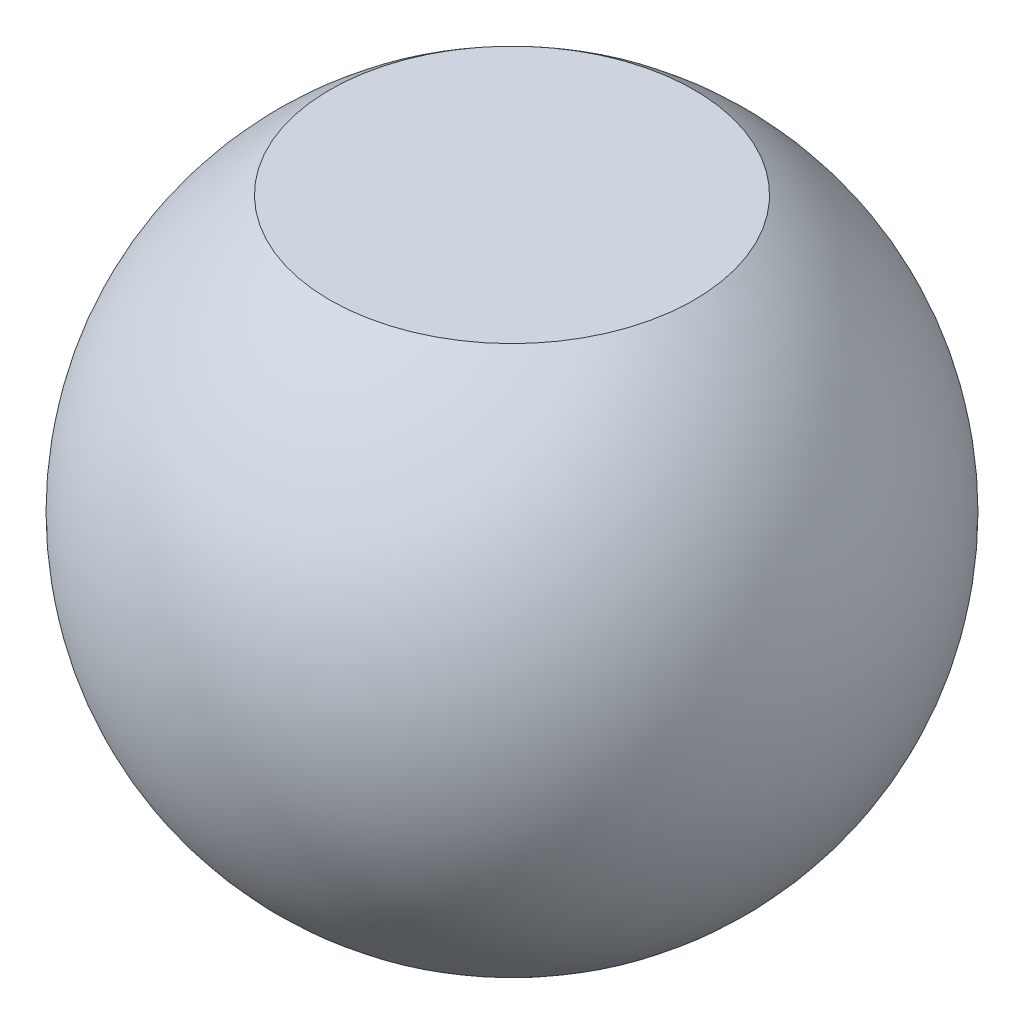
ISO-10303-21;
HEADER;
FILE_DESCRIPTION(('STEP AP214'),'2;1');
FILE_NAME('part.step','',(''),(''),'','','');
FILE_SCHEMA(('AUTOMOTIVE_DESIGN { 1 0 10303 214 1 1 1 1 }'));
ENDSEC;
DATA;
#1=APPLICATION_CONTEXT('core data for automotive mechanical design processes');
#2=APPLICATION_PROTOCOL_DEFINITION('international standard','automotive_design',2000,#1);
#3=PRODUCT_CONTEXT('',#1,'mechanical');
#4=PRODUCT('Part','Part','',(#3));
#5=PRODUCT_RELATED_PRODUCT_CATEGORY('part','',(#4));
#6=PRODUCT_DEFINITION_FORMATION('','',#4);
#7=PRODUCT_DEFINITION_CONTEXT('part definition',#1,'design');
#8=PRODUCT_DEFINITION('design','',#6,#7);
#9=PRODUCT_DEFINITION_SHAPE('','',#8);
#10=(LENGTH_UNIT() NAMED_UNIT(*) SI_UNIT(.MILLI.,.METRE.));
#11=(NAMED_UNIT(*) PLANE_ANGLE_UNIT() SI_UNIT($,.RADIAN.));
#12=(NAMED_UNIT(*) SI_UNIT($,.STERADIAN.) SOLID_ANGLE_UNIT());
#13=UNCERTAINTY_MEASURE_WITH_UNIT(LENGTH_MEASURE(1.E-05),#10,'distance_accuracy_value','');
#14=(GEOMETRIC_REPRESENTATION_CONTEXT(3) GLOBAL_UNCERTAINTY_ASSIGNED_CONTEXT((#13)) GLOBAL_UNIT_ASSIGNED_CONTEXT((#10,
#11,#12)) REPRESENTATION_CONTEXT('',''));
#15=CARTESIAN_POINT('',(0.,0.,0.));
#16=DIRECTION('',(0.,0.,1.));
#17=DIRECTION('',(1.,0.,0.));
#18=AXIS2_PLACEMENT_3D('',#15,#16,#17);
#19=CARTESIAN_POINT('',(0.,15.,0.));
#20=DIRECTION('',(0.,1.,0.));
#21=DIRECTION('',(0.,0.,1.));
#22=AXIS2_PLACEMENT_3D('',#19,#20,#21);
#23=PLANE('',#22);
#24=CARTESIAN_POINT('',(0.,15.,0.));
#25=DIRECTION('',(0.,1.,0.));
#26=DIRECTION('',(0.,0.,1.));
#27=AXIS2_PLACEMENT_3D('',#24,#25,#26);
#28=CIRCLE('',#27,9.94987437106625);
#29=CARTESIAN_POINT('',(0.,15.,9.94987437106625));
#30=VERTEX_POINT('',#29);
#31=EDGE_CURVE('E10',#30,#30,#28,.T.);
#32=ORIENTED_EDGE('',*,*,#31,.T.);
#33=EDGE_LOOP('',(#32));
#34=FACE_BOUND('',#33,.T.);
#35=ADVANCED_FACE('F34',(#34),#23,.T.);
#36=CARTESIAN_POINT('',(0.,0.,0.));
#37=DIRECTION('',(0.,1.,0.));
#38=DIRECTION('',(-1.,0.,0.));
#39=AXIS2_PLACEMENT_3D('',#36,#37,#38);
#40=SPHERICAL_SURFACE('',#39,18.);
#41=CARTESIAN_POINT('',(-15.4147778908404,-9.25640978077701,-0.838739940727965));
#42=CARTESIAN_POINT('',(-15.3804351702343,-9.30682636484546,-0.913485578954676));
#43=CARTESIAN_POINT('',(-15.3419228132776,-9.36319666589979,-0.982469287323736));
#44=CARTESIAN_POINT('',(-15.2584619752103,-9.48481406943779,-1.10773225208747));
#45=CARTESIAN_POINT('',(-15.2134920220949,-9.55009074870754,-1.16396744252283));
#46=CARTESIAN_POINT('',(-15.1191800400881,-9.68631415052398,-1.26290973639317));
#47=CARTESIAN_POINT('',(-15.069874500485,-9.75721313518111,-1.30571806685653));
#48=CARTESIAN_POINT('',(-14.9679772627336,-9.90296451952072,-1.37847195586576));
#49=CARTESIAN_POINT('',(-14.9153877573684,-9.97781427611793,-1.40842599452148));
#50=CARTESIAN_POINT('',(-14.7993386590385,-10.1420692051475,-1.459597370826));
#51=CARTESIAN_POINT('',(-14.7354906141538,-10.2318800445493,-1.478636338968));
#52=CARTESIAN_POINT('',(-14.6062571139547,-10.4124494858921,-1.5002054724113));
#53=CARTESIAN_POINT('',(-14.5408701174768,-10.5032089824929,-1.50271831461161));
#54=CARTESIAN_POINT('',(-14.4018844606048,-10.6948153189446,-1.49075980173468));
#55=CARTESIAN_POINT('',(-14.328269289792,-10.7955231446842,-1.47415183746707));
#56=CARTESIAN_POINT('',(-14.1829559958109,-10.9928109682027,-1.42041709920951));
#57=CARTESIAN_POINT('',(-14.1112574740629,-11.0893918267513,-1.3832946266982));
#58=CARTESIAN_POINT('',(-13.983541291879,-11.2601892436417,-1.29605534320235));
#59=CARTESIAN_POINT('',(-13.9268668813904,-11.3354919106266,-1.24902412042214));
#60=CARTESIAN_POINT('',(-13.8184705438116,-11.4787045466181,-1.1402626478502));
#61=CARTESIAN_POINT('',(-13.7667424938087,-11.5466236700794,-1.07855090958582));
#62=CARTESIAN_POINT('',(-13.6802632649748,-11.6596135275876,-0.954393603135493));
#63=CARTESIAN_POINT('',(-13.6441855917236,-11.7065374561735,-0.894561611860937));
#64=CARTESIAN_POINT('',(-13.5783034386515,-11.7919409009364,-0.766042476203712));
#65=CARTESIAN_POINT('',(-13.5484919973409,-11.8304297900953,-0.69736529673));
#66=CARTESIAN_POINT('',(-13.5007541068307,-11.8919106555832,-0.56319207867767));
#67=CARTESIAN_POINT('',(-13.4817158206437,-11.9163609614903,-0.498763191713361));
#68=CARTESIAN_POINT('',(-13.4504839444224,-11.9564156057641,-0.365617976604274));
#69=CARTESIAN_POINT('',(-13.4382867577734,-11.9720245923766,-0.296903922482736));
#70=CARTESIAN_POINT('',(-13.4215153886198,-11.9934760904389,-0.156754272470601));
#71=CARTESIAN_POINT('',(-13.4169712976557,-11.9992800493467,-0.0853090578206276));
#72=CARTESIAN_POINT('',(-13.415943626465,-12.0005932048153,0.0577326276585013));
#73=CARTESIAN_POINT('',(-13.4194591238089,-11.9961035794893,0.129329080241297));
#74=CARTESIAN_POINT('',(-13.4337812614731,-11.9777888375583,0.265620771007688));
#75=CARTESIAN_POINT('',(-13.4440865930987,-11.9646055391762,0.330458017108526));
#76=CARTESIAN_POINT('',(-13.4708539698182,-11.9302986155972,0.456644222540866));
#77=CARTESIAN_POINT('',(-13.4873170085276,-11.9091737089294,0.517992617065281));
#78=CARTESIAN_POINT('',(-13.5267033486999,-11.8585097474136,0.63956650079515));
#79=CARTESIAN_POINT('',(-13.5499538584983,-11.828543388421,0.699505913212842));
#80=CARTESIAN_POINT('',(-13.6013590212985,-11.7620806331156,0.813328243179216));
#81=CARTESIAN_POINT('',(-13.6295159285128,-11.7255812350298,0.867208358018582));
#82=CARTESIAN_POINT('',(-13.6947336391202,-11.6407380338646,0.976875539763861));
#83=CARTESIAN_POINT('',(-13.7324967218805,-11.5914337620005,1.03149899158038));
#84=CARTESIAN_POINT('',(-13.8119852232066,-11.4871737233014,1.1316909982374));
#85=CARTESIAN_POINT('',(-13.8537132040002,-11.4322143000213,1.17725363810271));
#86=CARTESIAN_POINT('',(-13.9490531336292,-11.3060300425801,1.26788876110707));
#87=CARTESIAN_POINT('',(-14.0033274537969,-11.2338048009678,1.31087330212669));
#88=CARTESIAN_POINT('',(-14.1145164322972,-11.0849298469117,1.38373964570114));
#89=CARTESIAN_POINT('',(-14.1714327396571,-11.0082773636607,1.41361313986221));
#90=CARTESIAN_POINT('',(-14.2971781980098,-10.8378725847198,1.46462407624425));
#91=CARTESIAN_POINT('',(-14.3662892355391,-10.7435483319999,1.48317990099939));
#92=CARTESIAN_POINT('',(-14.5047586978756,-10.5531800314995,1.50210941349211));
#93=CARTESIAN_POINT('',(-14.5741172895957,-10.4571345092234,1.50246668604544));
#94=CARTESIAN_POINT('',(-14.7171432745896,-10.2576770679122,1.48395793188995));
#95=CARTESIAN_POINT('',(-14.7906874227678,-10.1543190459722,1.46348574212946));
#96=CARTESIAN_POINT('',(-14.9338046680419,-9.9517421437384,1.40023097658677));
#97=CARTESIAN_POINT('',(-15.0033816868803,-9.85251920273916,1.35747087333923));
#98=CARTESIAN_POINT('',(-15.1201426933554,-9.6849454488531,1.2620059166138));
#99=CARTESIAN_POINT('',(-15.1687264660669,-9.61485011384755,1.2140577391843));
#100=CARTESIAN_POINT('',(-15.2605115478125,-9.48185164605578,1.10487646864342));
#101=CARTESIAN_POINT('',(-15.3037198491011,-9.41893917896559,1.04366092383921));
#102=CARTESIAN_POINT('',(-15.376702561666,-9.3122922023756,0.919216535813881));
#103=CARTESIAN_POINT('',(-15.4075206410642,-9.26709880969286,0.85785335996585));
#104=CARTESIAN_POINT('',(-15.462942251337,-9.18562787622381,0.72688594626188));
#105=CARTESIAN_POINT('',(-15.487547547703,-9.14934780261207,0.657284057883653));
#106=CARTESIAN_POINT('',(-15.5294781261495,-9.08741692153911,0.510847362223203));
#107=CARTESIAN_POINT('',(-15.5467561550977,-9.06183512086874,0.433969404922843));
#108=CARTESIAN_POINT('',(-15.572748441697,-9.02331806111654,0.275726338733522));
#109=CARTESIAN_POINT('',(-15.5814690947248,-9.01037335770528,0.194364628893212));
#110=CARTESIAN_POINT('',(-15.5893007542583,-8.9987482565554,0.0395855694478512));
#111=CARTESIAN_POINT('',(-15.589396710551,-8.99860582529907,-0.0336761740824039));
#112=CARTESIAN_POINT('',(-15.5824279973637,-9.00894999375857,-0.17910968862383));
#113=CARTESIAN_POINT('',(-15.5753628324118,-9.01943732893895,-0.251281383864812));
#114=CARTESIAN_POINT('',(-15.5548309258529,-9.04987307238039,-0.389861716014118));
#115=CARTESIAN_POINT('',(-15.5416008637312,-9.06947162764868,-0.456384034792637));
#116=CARTESIAN_POINT('',(-15.5094490466411,-9.11701169395047,-0.584828678253829));
#117=CARTESIAN_POINT('',(-15.4905339040931,-9.14494351213778,-0.646756243399571));
#118=CARTESIAN_POINT('',(-15.4608181050016,-9.18872257474849,-0.728859833877091));
#119=CARTESIAN_POINT('',(-15.452099876477,-9.20155688712752,-0.751474738417158));
#120=CARTESIAN_POINT('',(-15.433959129244,-9.22823737715034,-0.795794622711858));
#121=CARTESIAN_POINT('',(-15.4245368574587,-9.24208319999797,-0.817499917356254));
#122=CARTESIAN_POINT('',(-15.4147778908404,-9.25640978077701,-0.838739940727965));
#123=B_SPLINE_CURVE_WITH_KNOTS('',3,(#41,#42,#43,#44,#45,#46,#47,#48,#49,#50,#51,#52,#53,#54,
#55,#56,#57,#58,#59,#60,#61,#62,#63,#64,#65,#66,#67,#68,#69,#70,#71,#72,#73,#74,#75,#76,#77,#78,
#79,#80,#81,#82,#83,#84,#85,#86,#87,#88,#89,#90,#91,#92,#93,#94,#95,#96,#97,#98,#99,#100,#101,
#102,#103,#104,#105,#106,#107,#108,#109,#110,#111,#112,#113,#114,#115,#116,#117,#118,#119,#120,
#121,#122),.UNSPECIFIED.,.T.,.F.,(4,2,2,2,2,2,2,2,2,2,2,2,2,2,2,2,2,2,2,2,2,2,2,2,2,2,2,2,2,2,2,
2,2,2,2,2,2,2,2,2,4),(0.,0.289323503477626,0.579632318226849,0.867696698815311,1.15557074709461,
1.48971922596825,1.82421791193354,2.20004113804349,2.5757855914862,2.89056542665819,
3.20495042190451,3.45647893552668,3.70772651834836,3.92130014448048,4.13476138168741,
4.34905999362577,4.56333408005636,4.76333405021138,4.9633663065507,5.17534967605481,
5.38743069798403,5.63465671272261,5.88204359270443,6.1810744956317,6.48029462004847,
6.83400524740112,7.18803491784754,7.57159901398183,7.95477711476957,8.24716765214055,
8.53917378905374,8.78477865311612,9.03031364470708,9.27740884726008,9.52431924162236,
9.74299162939291,9.961679147954,10.1725867991304,10.3832500829104,10.465494132361,
10.5477094712308),.UNSPECIFIED.);
#124=CARTESIAN_POINT('',(-15.4147778908404,-9.25640978077701,-0.838739940727965));
#125=VERTEX_POINT('',#124);
#126=EDGE_CURVE('E37',#125,#125,#123,.T.);
#127=ORIENTED_EDGE('',*,*,#126,.F.);
#128=EDGE_LOOP('',(#127));
#129=FACE_BOUND('',#128,.T.);
#130=CARTESIAN_POINT('',(-17.7482393492989,0.,0.));
#131=DIRECTION('',(1.,0.,0.));
#132=DIRECTION('',(0.,0.,-1.));
#133=AXIS2_PLACEMENT_3D('',#130,#131,#132);
#134=CIRCLE('',#133,3.);
#135=CARTESIAN_POINT('',(-17.7482393492989,0.,-3.));
#136=VERTEX_POINT('',#135);
#137=EDGE_CURVE('E50',#136,#136,#134,.F.);
#138=ORIENTED_EDGE('',*,*,#137,.F.);
#139=EDGE_LOOP('',(#138));
#140=FACE_BOUND('',#139,.T.);
#141=CARTESIAN_POINT('',(0.,-15.,0.));
#142=DIRECTION('',(0.,1.,0.));
#143=DIRECTION('',(0.,0.,1.));
#144=AXIS2_PLACEMENT_3D('',#141,#142,#143);
#145=CIRCLE('',#144,9.94987437106625);
#146=CARTESIAN_POINT('',(0.,-15.,9.94987437106625));
#147=VERTEX_POINT('',#146);
#148=EDGE_CURVE('E45',#147,#147,#145,.T.);
#149=ORIENTED_EDGE('',*,*,#148,.T.);
#150=EDGE_LOOP('',(#149));
#151=FACE_BOUND('',#150,.T.);
#152=ORIENTED_EDGE('',*,*,#31,.F.);
#153=EDGE_LOOP('',(#152));
#154=FACE_BOUND('',#153,.T.);
#155=ADVANCED_FACE('F77',(#129,#140,#151,#154),#40,.T.);
#156=CARTESIAN_POINT('',(0.,-15.,0.));
#157=DIRECTION('',(0.,-1.,0.));
#158=DIRECTION('',(0.,0.,-1.));
#159=AXIS2_PLACEMENT_3D('',#156,#157,#158);
#160=PLANE('',#159);
#161=ORIENTED_EDGE('',*,*,#148,.F.);
#162=EDGE_LOOP('',(#161));
#163=FACE_BOUND('',#162,.T.);
#164=ADVANCED_FACE('F81',(#163),#160,.T.);
#165=CARTESIAN_POINT('',(-18.,0.,0.));
#166=DIRECTION('',(1.,0.,0.));
#167=DIRECTION('',(0.,0.,-1.));
#168=AXIS2_PLACEMENT_3D('',#165,#166,#167);
#169=CYLINDRICAL_SURFACE('',#168,3.);
#170=ORIENTED_EDGE('',*,*,#137,.T.);
#171=EDGE_LOOP('',(#170));
#172=FACE_BOUND('',#171,.T.);
#173=CARTESIAN_POINT('',(0.,0.,0.));
#174=DIRECTION('',(1.,0.,0.));
#175=DIRECTION('',(0.,0.,-1.));
#176=AXIS2_PLACEMENT_3D('',#173,#174,#175);
#177=CIRCLE('',#176,3.);
#178=CARTESIAN_POINT('',(0.,0.,-3.));
#179=VERTEX_POINT('',#178);
#180=EDGE_CURVE('E54',#179,#179,#177,.T.);
#181=ORIENTED_EDGE('',*,*,#180,.T.);
#182=EDGE_LOOP('',(#181));
#183=FACE_BOUND('',#182,.T.);
#184=ADVANCED_FACE('F86',(#172,#183),#169,.F.);
#185=CARTESIAN_POINT('',(0.,0.,0.));
#186=DIRECTION('',(1.,0.,0.));
#187=DIRECTION('',(0.,0.,-1.));
#188=AXIS2_PLACEMENT_3D('',#185,#186,#187);
#189=PLANE('',#188);
#190=ORIENTED_EDGE('',*,*,#180,.F.);
#191=EDGE_LOOP('',(#190));
#192=FACE_BOUND('',#191,.T.);
#193=ADVANCED_FACE('F74',(#192),#189,.F.);
#194=CARTESIAN_POINT('',(-17.7482393492989,-10.5,0.));
#195=DIRECTION('',(1.,0.,0.));
#196=DIRECTION('',(0.,0.,-1.));
#197=AXIS2_PLACEMENT_3D('',#194,#195,#196);
#198=CYLINDRICAL_SURFACE('',#197,1.5);
#199=ORIENTED_EDGE('',*,*,#126,.T.);
#200=EDGE_LOOP('',(#199));
#201=FACE_BOUND('',#200,.T.);
#202=CARTESIAN_POINT('',(0.,-10.5,0.));
#203=DIRECTION('',(1.,0.,0.));
#204=DIRECTION('',(0.,0.,-1.));
#205=AXIS2_PLACEMENT_3D('',#202,#203,#204);
#206=CIRCLE('',#205,1.5);
#207=CARTESIAN_POINT('',(0.,-10.5,-1.5));
#208=VERTEX_POINT('',#207);
#209=EDGE_CURVE('E61',#208,#208,#206,.T.);
#210=ORIENTED_EDGE('',*,*,#209,.T.);
#211=EDGE_LOOP('',(#210));
#212=FACE_BOUND('',#211,.T.);
#213=ADVANCED_FACE('F66',(#201,#212),#198,.F.);
#214=CARTESIAN_POINT('',(0.,-10.5,0.));
#215=DIRECTION('',(1.,0.,0.));
#216=DIRECTION('',(0.,0.,-1.));
#217=AXIS2_PLACEMENT_3D('',#214,#215,#216);
#218=PLANE('',#217);
#219=ORIENTED_EDGE('',*,*,#209,.F.);
#220=EDGE_LOOP('',(#219));
#221=FACE_BOUND('',#220,.T.);
#222=ADVANCED_FACE('F68',(#221),#218,.F.);
#223=CLOSED_SHELL('',(#35,#155,#164,#184,#193,#213,#222));
#224=MANIFOLD_SOLID_BREP('B2',#223);
#225=ADVANCED_BREP_SHAPE_REPRESENTATION('',(#18,#224),#14);
#226=SHAPE_DEFINITION_REPRESENTATION(#9,#225);
ENDSEC;
END-ISO-10303-21;
